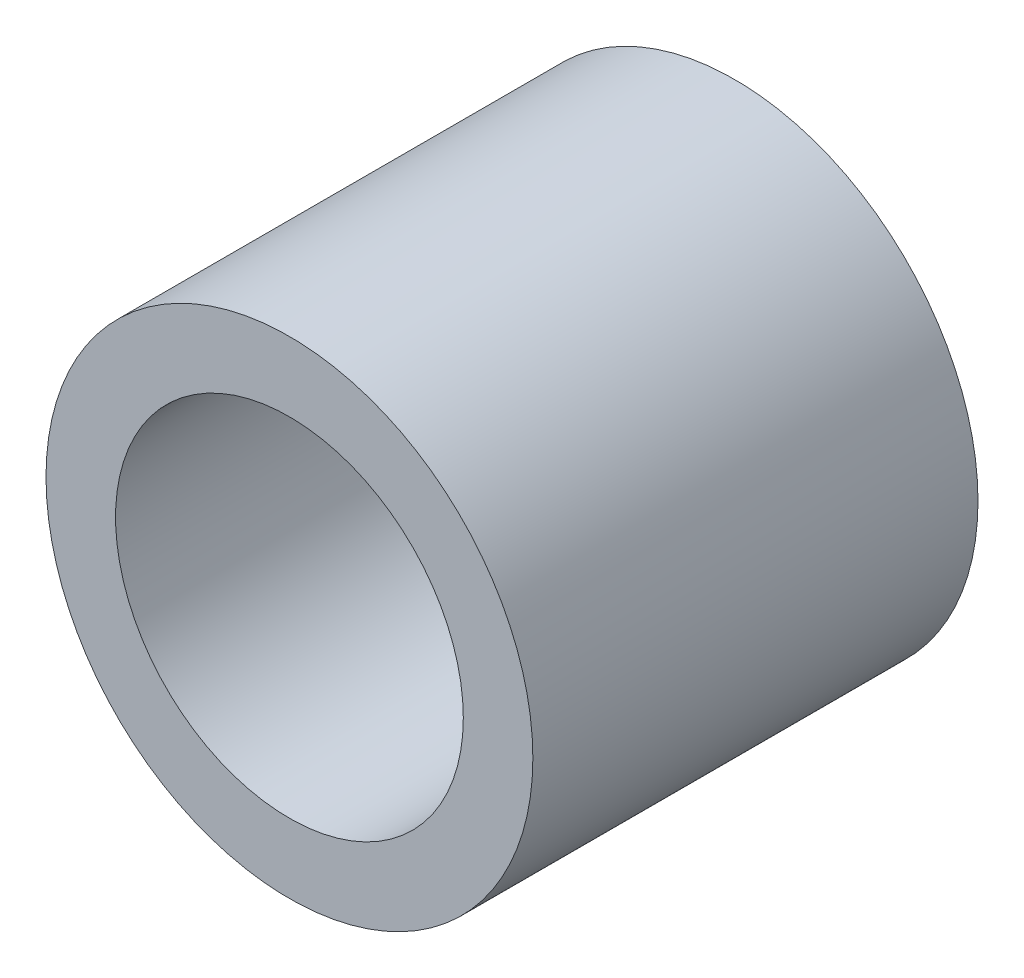
ISO-10303-21;
HEADER;
FILE_DESCRIPTION(('STEP AP214'),'2;1');
FILE_NAME('part.step','',(''),(''),'','','');
FILE_SCHEMA(('AUTOMOTIVE_DESIGN { 1 0 10303 214 1 1 1 1 }'));
ENDSEC;
DATA;
#1=APPLICATION_CONTEXT('core data for automotive mechanical design processes');
#2=APPLICATION_PROTOCOL_DEFINITION('international standard','automotive_design',2000,#1);
#3=PRODUCT_CONTEXT('',#1,'mechanical');
#4=PRODUCT('Part','Part','',(#3));
#5=PRODUCT_RELATED_PRODUCT_CATEGORY('part','',(#4));
#6=PRODUCT_DEFINITION_FORMATION('','',#4);
#7=PRODUCT_DEFINITION_CONTEXT('part definition',#1,'design');
#8=PRODUCT_DEFINITION('design','',#6,#7);
#9=PRODUCT_DEFINITION_SHAPE('','',#8);
#10=(LENGTH_UNIT() NAMED_UNIT(*) SI_UNIT(.MILLI.,.METRE.));
#11=(NAMED_UNIT(*) PLANE_ANGLE_UNIT() SI_UNIT($,.RADIAN.));
#12=(NAMED_UNIT(*) SI_UNIT($,.STERADIAN.) SOLID_ANGLE_UNIT());
#13=UNCERTAINTY_MEASURE_WITH_UNIT(LENGTH_MEASURE(1.E-05),#10,'distance_accuracy_value','');
#14=(GEOMETRIC_REPRESENTATION_CONTEXT(3) GLOBAL_UNCERTAINTY_ASSIGNED_CONTEXT((#13)) GLOBAL_UNIT_ASSIGNED_CONTEXT((#10,
#11,#12)) REPRESENTATION_CONTEXT('',''));
#15=CARTESIAN_POINT('',(0.,0.,0.));
#16=DIRECTION('',(0.,0.,1.));
#17=DIRECTION('',(1.,0.,0.));
#18=AXIS2_PLACEMENT_3D('',#15,#16,#17);
#19=CARTESIAN_POINT('',(0.,0.,20.32));
#20=DIRECTION('',(0.,0.,1.));
#21=DIRECTION('',(1.,0.,0.));
#22=AXIS2_PLACEMENT_3D('',#19,#20,#21);
#23=PLANE('',#22);
#24=CARTESIAN_POINT('',(0.,0.,20.32));
#25=DIRECTION('',(0.,0.,1.));
#26=DIRECTION('',(1.,0.,0.));
#27=AXIS2_PLACEMENT_3D('',#24,#25,#26);
#28=CIRCLE('',#27,11.1125);
#29=CARTESIAN_POINT('',(11.1125,0.,20.32));
#30=VERTEX_POINT('',#29);
#31=EDGE_CURVE('E10',#30,#30,#28,.T.);
#32=ORIENTED_EDGE('',*,*,#31,.T.);
#33=EDGE_LOOP('',(#32));
#34=FACE_BOUND('',#33,.T.);
#35=CARTESIAN_POINT('',(0.,0.,20.32));
#36=DIRECTION('',(0.,0.,1.));
#37=DIRECTION('',(1.,0.,0.));
#38=AXIS2_PLACEMENT_3D('',#35,#36,#37);
#39=CIRCLE('',#38,7.9375);
#40=CARTESIAN_POINT('',(7.9375,0.,20.32));
#41=VERTEX_POINT('',#40);
#42=EDGE_CURVE('E56',#41,#41,#39,.T.);
#43=ORIENTED_EDGE('',*,*,#42,.F.);
#44=EDGE_LOOP('',(#43));
#45=FACE_BOUND('',#44,.T.);
#46=ADVANCED_FACE('F43',(#34,#45),#23,.T.);
#47=CARTESIAN_POINT('',(0.,0.,0.));
#48=DIRECTION('',(0.,0.,1.));
#49=DIRECTION('',(1.,0.,0.));
#50=AXIS2_PLACEMENT_3D('',#47,#48,#49);
#51=PLANE('',#50);
#52=CARTESIAN_POINT('',(0.,0.,0.));
#53=DIRECTION('',(0.,0.,1.));
#54=DIRECTION('',(1.,0.,0.));
#55=AXIS2_PLACEMENT_3D('',#52,#53,#54);
#56=CIRCLE('',#55,11.1125);
#57=CARTESIAN_POINT('',(11.1125,0.,0.));
#58=VERTEX_POINT('',#57);
#59=EDGE_CURVE('E47',#58,#58,#56,.T.);
#60=ORIENTED_EDGE('',*,*,#59,.F.);
#61=EDGE_LOOP('',(#60));
#62=FACE_BOUND('',#61,.T.);
#63=CARTESIAN_POINT('',(0.,0.,0.));
#64=DIRECTION('',(0.,0.,1.));
#65=DIRECTION('',(1.,0.,0.));
#66=AXIS2_PLACEMENT_3D('',#63,#64,#65);
#67=CIRCLE('',#66,7.9375);
#68=CARTESIAN_POINT('',(7.9375,0.,0.));
#69=VERTEX_POINT('',#68);
#70=EDGE_CURVE('E58',#69,#69,#67,.T.);
#71=ORIENTED_EDGE('',*,*,#70,.T.);
#72=EDGE_LOOP('',(#71));
#73=FACE_BOUND('',#72,.T.);
#74=ADVANCED_FACE('F70',(#62,#73),#51,.F.);
#75=CARTESIAN_POINT('',(0.,0.,20.32));
#76=DIRECTION('',(0.,0.,-1.));
#77=DIRECTION('',(-1.,0.,0.));
#78=AXIS2_PLACEMENT_3D('',#75,#76,#77);
#79=CYLINDRICAL_SURFACE('',#78,11.1125);
#80=ORIENTED_EDGE('',*,*,#31,.F.);
#81=EDGE_LOOP('',(#80));
#82=FACE_BOUND('',#81,.T.);
#83=ORIENTED_EDGE('',*,*,#59,.T.);
#84=EDGE_LOOP('',(#83));
#85=FACE_BOUND('',#84,.T.);
#86=ADVANCED_FACE('F45',(#82,#85),#79,.T.);
#87=CARTESIAN_POINT('',(0.,0.,20.32));
#88=DIRECTION('',(0.,0.,-1.));
#89=DIRECTION('',(-1.,0.,0.));
#90=AXIS2_PLACEMENT_3D('',#87,#88,#89);
#91=CYLINDRICAL_SURFACE('',#90,7.9375);
#92=ORIENTED_EDGE('',*,*,#42,.T.);
#93=EDGE_LOOP('',(#92));
#94=FACE_BOUND('',#93,.T.);
#95=ORIENTED_EDGE('',*,*,#70,.F.);
#96=EDGE_LOOP('',(#95));
#97=FACE_BOUND('',#96,.T.);
#98=ADVANCED_FACE('F66',(#94,#97),#91,.F.);
#99=CLOSED_SHELL('',(#46,#74,#86,#98));
#100=MANIFOLD_SOLID_BREP('B2',#99);
#101=ADVANCED_BREP_SHAPE_REPRESENTATION('',(#18,#100),#14);
#102=SHAPE_DEFINITION_REPRESENTATION(#9,#101);
ENDSEC;
END-ISO-10303-21;
